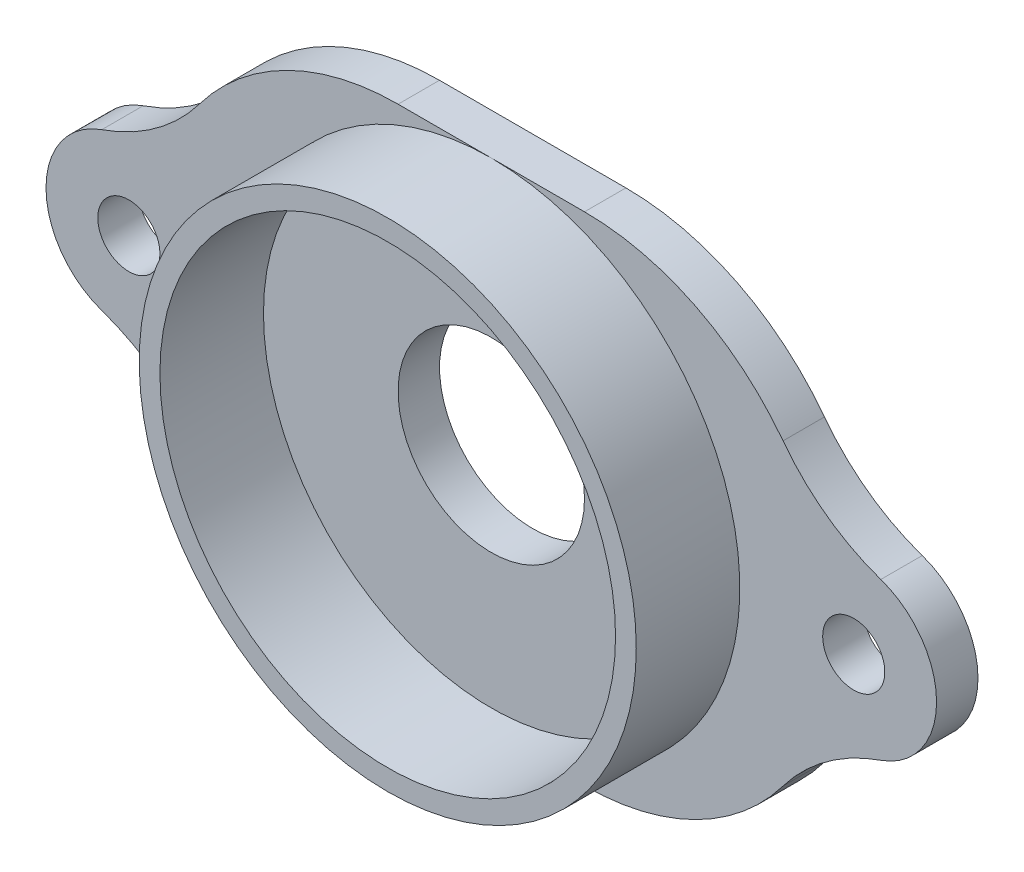
ISO-10303-21;
HEADER;
FILE_DESCRIPTION(('STEP AP214'),'2;1');
FILE_NAME('part.step','',(''),(''),'','','');
FILE_SCHEMA(('AUTOMOTIVE_DESIGN { 1 0 10303 214 1 1 1 1 }'));
ENDSEC;
DATA;
#1=APPLICATION_CONTEXT('core data for automotive mechanical design processes');
#2=APPLICATION_PROTOCOL_DEFINITION('international standard','automotive_design',2000,#1);
#3=PRODUCT_CONTEXT('',#1,'mechanical');
#4=PRODUCT('Part','Part','',(#3));
#5=PRODUCT_RELATED_PRODUCT_CATEGORY('part','',(#4));
#6=PRODUCT_DEFINITION_FORMATION('','',#4);
#7=PRODUCT_DEFINITION_CONTEXT('part definition',#1,'design');
#8=PRODUCT_DEFINITION('design','',#6,#7);
#9=PRODUCT_DEFINITION_SHAPE('','',#8);
#10=(LENGTH_UNIT() NAMED_UNIT(*) SI_UNIT(.MILLI.,.METRE.));
#11=(NAMED_UNIT(*) PLANE_ANGLE_UNIT() SI_UNIT($,.RADIAN.));
#12=(NAMED_UNIT(*) SI_UNIT($,.STERADIAN.) SOLID_ANGLE_UNIT());
#13=UNCERTAINTY_MEASURE_WITH_UNIT(LENGTH_MEASURE(1.E-05),#10,'distance_accuracy_value','');
#14=(GEOMETRIC_REPRESENTATION_CONTEXT(3) GLOBAL_UNCERTAINTY_ASSIGNED_CONTEXT((#13)) GLOBAL_UNIT_ASSIGNED_CONTEXT((#10,
#11,#12)) REPRESENTATION_CONTEXT('',''));
#15=CARTESIAN_POINT('',(0.,0.,0.));
#16=DIRECTION('',(0.,0.,1.));
#17=DIRECTION('',(1.,0.,0.));
#18=AXIS2_PLACEMENT_3D('',#15,#16,#17);
#19=CARTESIAN_POINT('',(4.5,0.,1.));
#20=DIRECTION('',(0.,0.,-1.));
#21=DIRECTION('',(-1.,0.,0.));
#22=AXIS2_PLACEMENT_3D('',#19,#20,#21);
#23=PLANE('',#22);
#24=CARTESIAN_POINT('',(-17.5,0.,1.));
#25=DIRECTION('',(0.,0.,-1.));
#26=DIRECTION('',(-1.,0.,0.));
#27=AXIS2_PLACEMENT_3D('',#24,#25,#26);
#28=CIRCLE('',#27,1.5);
#29=CARTESIAN_POINT('',(-19.,0.,1.));
#30=VERTEX_POINT('',#29);
#31=EDGE_CURVE('E351',#30,#30,#28,.T.);
#32=ORIENTED_EDGE('',*,*,#31,.T.);
#33=EDGE_LOOP('',(#32));
#34=FACE_BOUND('',#33,.T.);
#35=CARTESIAN_POINT('',(0.,0.,1.));
#36=DIRECTION('',(0.,0.,1.));
#37=DIRECTION('',(1.,0.,0.));
#38=AXIS2_PLACEMENT_3D('',#35,#36,#37);
#39=CIRCLE('',#38,12.);
#40=CARTESIAN_POINT('',(0.,12.,1.));
#41=VERTEX_POINT('',#40);
#42=CARTESIAN_POINT('',(0.,-12.,1.));
#43=VERTEX_POINT('',#42);
#44=EDGE_CURVE('E51',#41,#43,#39,.T.);
#45=ORIENTED_EDGE('',*,*,#44,.F.);
#46=DIRECTION('',(1.,0.,0.));
#47=VECTOR('',#46,1.);
#48=CARTESIAN_POINT('',(-4.5,12.,1.));
#49=LINE('',#48,#47);
#50=CARTESIAN_POINT('',(-4.5,12.,1.));
#51=VERTEX_POINT('',#50);
#52=EDGE_CURVE('E257',#51,#41,#49,.T.);
#53=ORIENTED_EDGE('',*,*,#52,.F.);
#54=CARTESIAN_POINT('',(-4.5,0.,1.));
#55=DIRECTION('',(0.,0.,1.));
#56=DIRECTION('',(1.,0.,0.));
#57=AXIS2_PLACEMENT_3D('',#54,#55,#56);
#58=CIRCLE('',#57,12.);
#59=CARTESIAN_POINT('',(-14.0874125874126,7.21675272395575,1.));
#60=VERTEX_POINT('',#59);
#61=EDGE_CURVE('E148',#51,#60,#58,.T.);
#62=ORIENTED_EDGE('',*,*,#61,.T.);
#63=CARTESIAN_POINT('',(-22.0769230769231,13.2307133272522,1.));
#64=DIRECTION('',(0.,0.,-1.));
#65=DIRECTION('',(-1.,0.,0.));
#66=AXIS2_PLACEMENT_3D('',#63,#64,#65);
#67=CIRCLE('',#66,10.);
#68=CARTESIAN_POINT('',(-18.8076923076923,3.78020380778634,1.));
#69=VERTEX_POINT('',#68);
#70=EDGE_CURVE('E140',#60,#69,#67,.T.);
#71=ORIENTED_EDGE('',*,*,#70,.T.);
#72=CARTESIAN_POINT('',(-17.5,0.,1.));
#73=DIRECTION('',(0.,0.,-1.));
#74=DIRECTION('',(-1.,0.,0.));
#75=AXIS2_PLACEMENT_3D('',#72,#73,#74);
#76=CIRCLE('',#75,4.);
#77=CARTESIAN_POINT('',(-18.8076923076923,-3.78020380778634,1.));
#78=VERTEX_POINT('',#77);
#79=EDGE_CURVE('E145',#78,#69,#76,.T.);
#80=ORIENTED_EDGE('',*,*,#79,.F.);
#81=CARTESIAN_POINT('',(-22.0769230769231,-13.2307133272522,1.));
#82=DIRECTION('',(0.,0.,1.));
#83=DIRECTION('',(1.,0.,0.));
#84=AXIS2_PLACEMENT_3D('',#81,#82,#83);
#85=CIRCLE('',#84,10.);
#86=CARTESIAN_POINT('',(-14.0874125874126,-7.21675272395575,1.));
#87=VERTEX_POINT('',#86);
#88=EDGE_CURVE('E168',#87,#78,#85,.T.);
#89=ORIENTED_EDGE('',*,*,#88,.F.);
#90=CARTESIAN_POINT('',(-4.5,0.,1.));
#91=DIRECTION('',(0.,0.,-1.));
#92=DIRECTION('',(-1.,0.,0.));
#93=AXIS2_PLACEMENT_3D('',#90,#91,#92);
#94=CIRCLE('',#93,12.);
#95=CARTESIAN_POINT('',(-4.5,-12.,1.));
#96=VERTEX_POINT('',#95);
#97=EDGE_CURVE('E171',#96,#87,#94,.T.);
#98=ORIENTED_EDGE('',*,*,#97,.F.);
#99=DIRECTION('',(1.,0.,0.));
#100=VECTOR('',#99,1.);
#101=CARTESIAN_POINT('',(-4.5,-12.,1.));
#102=LINE('',#101,#100);
#103=EDGE_CURVE('E282',#96,#43,#102,.T.);
#104=ORIENTED_EDGE('',*,*,#103,.T.);
#105=EDGE_LOOP('',(#45,#53,#62,#71,#80,#89,#98,#104));
#106=FACE_BOUND('',#105,.T.);
#107=ADVANCED_FACE('F39',(#34,#106),#23,.F.);
#108=CARTESIAN_POINT('',(-4.5,12.,1.));
#109=DIRECTION('',(0.,1.,0.));
#110=DIRECTION('',(0.,0.,1.));
#111=AXIS2_PLACEMENT_3D('',#108,#109,#110);
#112=PLANE('',#111);
#113=DIRECTION('',(1.,0.,0.));
#114=VECTOR('',#113,1.);
#115=CARTESIAN_POINT('',(-4.5,12.,-1.));
#116=LINE('',#115,#114);
#117=CARTESIAN_POINT('',(-4.5,12.,-1.));
#118=VERTEX_POINT('',#117);
#119=CARTESIAN_POINT('',(4.5,12.,-1.));
#120=VERTEX_POINT('',#119);
#121=EDGE_CURVE('E177',#118,#120,#116,.T.);
#122=ORIENTED_EDGE('',*,*,#121,.F.);
#123=DIRECTION('',(0.,0.,-1.));
#124=VECTOR('',#123,1.);
#125=CARTESIAN_POINT('',(-4.5,12.,1.));
#126=LINE('',#125,#124);
#127=EDGE_CURVE('E49',#51,#118,#126,.T.);
#128=ORIENTED_EDGE('',*,*,#127,.F.);
#129=ORIENTED_EDGE('',*,*,#52,.T.);
#130=CARTESIAN_POINT('',(4.5,12.,1.));
#131=VERTEX_POINT('',#130);
#132=EDGE_CURVE('E111',#41,#131,#49,.T.);
#133=ORIENTED_EDGE('',*,*,#132,.T.);
#134=DIRECTION('',(0.,0.,-1.));
#135=VECTOR('',#134,1.);
#136=CARTESIAN_POINT('',(4.5,12.,1.));
#137=LINE('',#136,#135);
#138=EDGE_CURVE('E43',#131,#120,#137,.T.);
#139=ORIENTED_EDGE('',*,*,#138,.T.);
#140=EDGE_LOOP('',(#122,#128,#129,#133,#139));
#141=FACE_BOUND('',#140,.T.);
#142=ADVANCED_FACE('F41',(#141),#112,.T.);
#143=CARTESIAN_POINT('',(-4.5,0.,1.));
#144=DIRECTION('',(0.,0.,-1.));
#145=DIRECTION('',(-1.,0.,0.));
#146=AXIS2_PLACEMENT_3D('',#143,#144,#145);
#147=CYLINDRICAL_SURFACE('',#146,12.);
#148=CARTESIAN_POINT('',(-4.5,0.,-1.));
#149=DIRECTION('',(0.,0.,1.));
#150=DIRECTION('',(1.,0.,0.));
#151=AXIS2_PLACEMENT_3D('',#148,#149,#150);
#152=CIRCLE('',#151,12.);
#153=CARTESIAN_POINT('',(-14.0874125874126,7.21675272395575,-1.));
#154=VERTEX_POINT('',#153);
#155=EDGE_CURVE('E216',#118,#154,#152,.T.);
#156=ORIENTED_EDGE('',*,*,#155,.T.);
#157=DIRECTION('',(0.,0.,-1.));
#158=VECTOR('',#157,1.);
#159=CARTESIAN_POINT('',(-14.0874125874126,7.21675272395575,1.));
#160=LINE('',#159,#158);
#161=EDGE_CURVE('E163',#60,#154,#160,.T.);
#162=ORIENTED_EDGE('',*,*,#161,.F.);
#163=ORIENTED_EDGE('',*,*,#61,.F.);
#164=ORIENTED_EDGE('',*,*,#127,.T.);
#165=EDGE_LOOP('',(#156,#162,#163,#164));
#166=FACE_BOUND('',#165,.T.);
#167=ADVANCED_FACE('F256',(#166),#147,.T.);
#168=CARTESIAN_POINT('',(-22.0769230769231,13.2307133272522,1.));
#169=DIRECTION('',(0.,0.,-1.));
#170=DIRECTION('',(-1.,0.,0.));
#171=AXIS2_PLACEMENT_3D('',#168,#169,#170);
#172=CYLINDRICAL_SURFACE('',#171,10.);
#173=CARTESIAN_POINT('',(-22.0769230769231,13.2307133272522,-1.));
#174=DIRECTION('',(0.,0.,-1.));
#175=DIRECTION('',(-1.,0.,0.));
#176=AXIS2_PLACEMENT_3D('',#173,#174,#175);
#177=CIRCLE('',#176,10.);
#178=CARTESIAN_POINT('',(-18.8076923076923,3.78020380778634,-1.));
#179=VERTEX_POINT('',#178);
#180=EDGE_CURVE('E158',#154,#179,#177,.T.);
#181=ORIENTED_EDGE('',*,*,#180,.T.);
#182=DIRECTION('',(0.,0.,-1.));
#183=VECTOR('',#182,1.);
#184=CARTESIAN_POINT('',(-18.8076923076923,3.78020380778634,1.));
#185=LINE('',#184,#183);
#186=EDGE_CURVE('E155',#69,#179,#185,.T.);
#187=ORIENTED_EDGE('',*,*,#186,.F.);
#188=ORIENTED_EDGE('',*,*,#70,.F.);
#189=ORIENTED_EDGE('',*,*,#161,.T.);
#190=EDGE_LOOP('',(#181,#187,#188,#189));
#191=FACE_BOUND('',#190,.T.);
#192=ADVANCED_FACE('F156',(#191),#172,.F.);
#193=CARTESIAN_POINT('',(-17.5,0.,1.));
#194=DIRECTION('',(0.,0.,-1.));
#195=DIRECTION('',(-1.,0.,0.));
#196=AXIS2_PLACEMENT_3D('',#193,#194,#195);
#197=CYLINDRICAL_SURFACE('',#196,4.);
#198=CARTESIAN_POINT('',(-17.5,0.,-1.));
#199=DIRECTION('',(0.,0.,-1.));
#200=DIRECTION('',(-1.,0.,0.));
#201=AXIS2_PLACEMENT_3D('',#198,#199,#200);
#202=CIRCLE('',#201,4.);
#203=CARTESIAN_POINT('',(-18.8076923076923,-3.78020380778634,-1.));
#204=VERTEX_POINT('',#203);
#205=EDGE_CURVE('E211',#204,#179,#202,.T.);
#206=ORIENTED_EDGE('',*,*,#205,.F.);
#207=DIRECTION('',(0.,0.,-1.));
#208=VECTOR('',#207,1.);
#209=CARTESIAN_POINT('',(-18.8076923076923,-3.78020380778634,1.));
#210=LINE('',#209,#208);
#211=EDGE_CURVE('E164',#78,#204,#210,.T.);
#212=ORIENTED_EDGE('',*,*,#211,.F.);
#213=ORIENTED_EDGE('',*,*,#79,.T.);
#214=ORIENTED_EDGE('',*,*,#186,.T.);
#215=EDGE_LOOP('',(#206,#212,#213,#214));
#216=FACE_BOUND('',#215,.T.);
#217=ADVANCED_FACE('F166',(#216),#197,.T.);
#218=CARTESIAN_POINT('',(-22.0769230769231,-13.2307133272522,1.));
#219=DIRECTION('',(0.,0.,-1.));
#220=DIRECTION('',(-1.,0.,0.));
#221=AXIS2_PLACEMENT_3D('',#218,#219,#220);
#222=CYLINDRICAL_SURFACE('',#221,10.);
#223=CARTESIAN_POINT('',(-22.0769230769231,-13.2307133272522,-1.));
#224=DIRECTION('',(0.,0.,1.));
#225=DIRECTION('',(1.,0.,0.));
#226=AXIS2_PLACEMENT_3D('',#223,#224,#225);
#227=CIRCLE('',#226,10.);
#228=CARTESIAN_POINT('',(-14.0874125874126,-7.21675272395575,-1.));
#229=VERTEX_POINT('',#228);
#230=EDGE_CURVE('E207',#229,#204,#227,.T.);
#231=ORIENTED_EDGE('',*,*,#230,.F.);
#232=DIRECTION('',(0.,0.,-1.));
#233=VECTOR('',#232,1.);
#234=CARTESIAN_POINT('',(-14.0874125874126,-7.21675272395575,1.));
#235=LINE('',#234,#233);
#236=EDGE_CURVE('E225',#87,#229,#235,.T.);
#237=ORIENTED_EDGE('',*,*,#236,.F.);
#238=ORIENTED_EDGE('',*,*,#88,.T.);
#239=ORIENTED_EDGE('',*,*,#211,.T.);
#240=EDGE_LOOP('',(#231,#237,#238,#239));
#241=FACE_BOUND('',#240,.T.);
#242=ADVANCED_FACE('F293',(#241),#222,.F.);
#243=CARTESIAN_POINT('',(-4.5,0.,1.));
#244=DIRECTION('',(0.,0.,-1.));
#245=DIRECTION('',(-1.,0.,0.));
#246=AXIS2_PLACEMENT_3D('',#243,#244,#245);
#247=CYLINDRICAL_SURFACE('',#246,12.);
#248=CARTESIAN_POINT('',(-4.5,0.,-1.));
#249=DIRECTION('',(0.,0.,-1.));
#250=DIRECTION('',(-1.,0.,0.));
#251=AXIS2_PLACEMENT_3D('',#248,#249,#250);
#252=CIRCLE('',#251,12.);
#253=CARTESIAN_POINT('',(-4.5,-12.,-1.));
#254=VERTEX_POINT('',#253);
#255=EDGE_CURVE('E203',#254,#229,#252,.T.);
#256=ORIENTED_EDGE('',*,*,#255,.F.);
#257=DIRECTION('',(0.,0.,-1.));
#258=VECTOR('',#257,1.);
#259=CARTESIAN_POINT('',(-4.5,-12.,1.));
#260=LINE('',#259,#258);
#261=EDGE_CURVE('E228',#96,#254,#260,.T.);
#262=ORIENTED_EDGE('',*,*,#261,.F.);
#263=ORIENTED_EDGE('',*,*,#97,.T.);
#264=ORIENTED_EDGE('',*,*,#236,.T.);
#265=EDGE_LOOP('',(#256,#262,#263,#264));
#266=FACE_BOUND('',#265,.T.);
#267=ADVANCED_FACE('F289',(#266),#247,.T.);
#268=CARTESIAN_POINT('',(-4.5,-12.,1.));
#269=DIRECTION('',(0.,1.,0.));
#270=DIRECTION('',(0.,0.,1.));
#271=AXIS2_PLACEMENT_3D('',#268,#269,#270);
#272=PLANE('',#271);
#273=DIRECTION('',(1.,0.,0.));
#274=VECTOR('',#273,1.);
#275=CARTESIAN_POINT('',(-4.5,-12.,-1.));
#276=LINE('',#275,#274);
#277=CARTESIAN_POINT('',(4.5,-12.,-1.));
#278=VERTEX_POINT('',#277);
#279=EDGE_CURVE('E200',#254,#278,#276,.T.);
#280=ORIENTED_EDGE('',*,*,#279,.T.);
#281=DIRECTION('',(0.,0.,-1.));
#282=VECTOR('',#281,1.);
#283=CARTESIAN_POINT('',(4.5,-12.,1.));
#284=LINE('',#283,#282);
#285=CARTESIAN_POINT('',(4.5,-12.,1.));
#286=VERTEX_POINT('',#285);
#287=EDGE_CURVE('E231',#286,#278,#284,.T.);
#288=ORIENTED_EDGE('',*,*,#287,.F.);
#289=EDGE_CURVE('E281',#43,#286,#102,.T.);
#290=ORIENTED_EDGE('',*,*,#289,.F.);
#291=ORIENTED_EDGE('',*,*,#103,.F.);
#292=ORIENTED_EDGE('',*,*,#261,.T.);
#293=EDGE_LOOP('',(#280,#288,#290,#291,#292));
#294=FACE_BOUND('',#293,.T.);
#295=ADVANCED_FACE('F299',(#294),#272,.F.);
#296=CARTESIAN_POINT('',(4.5,0.,1.));
#297=DIRECTION('',(0.,0.,-1.));
#298=DIRECTION('',(-1.,0.,0.));
#299=AXIS2_PLACEMENT_3D('',#296,#297,#298);
#300=CYLINDRICAL_SURFACE('',#299,12.);
#301=CARTESIAN_POINT('',(4.5,0.,-1.));
#302=DIRECTION('',(0.,0.,1.));
#303=DIRECTION('',(1.,0.,0.));
#304=AXIS2_PLACEMENT_3D('',#301,#302,#303);
#305=CIRCLE('',#304,12.);
#306=CARTESIAN_POINT('',(14.0874125874126,-7.21675272395575,-1.));
#307=VERTEX_POINT('',#306);
#308=EDGE_CURVE('E197',#278,#307,#305,.T.);
#309=ORIENTED_EDGE('',*,*,#308,.T.);
#310=DIRECTION('',(0.,0.,-1.));
#311=VECTOR('',#310,1.);
#312=CARTESIAN_POINT('',(14.0874125874126,-7.21675272395575,1.));
#313=LINE('',#312,#311);
#314=CARTESIAN_POINT('',(14.0874125874126,-7.21675272395575,1.));
#315=VERTEX_POINT('',#314);
#316=EDGE_CURVE('E235',#315,#307,#313,.T.);
#317=ORIENTED_EDGE('',*,*,#316,.F.);
#318=CARTESIAN_POINT('',(4.5,0.,1.));
#319=DIRECTION('',(0.,0.,1.));
#320=DIRECTION('',(1.,0.,0.));
#321=AXIS2_PLACEMENT_3D('',#318,#319,#320);
#322=CIRCLE('',#321,12.);
#323=EDGE_CURVE('E278',#286,#315,#322,.T.);
#324=ORIENTED_EDGE('',*,*,#323,.F.);
#325=ORIENTED_EDGE('',*,*,#287,.T.);
#326=EDGE_LOOP('',(#309,#317,#324,#325));
#327=FACE_BOUND('',#326,.T.);
#328=ADVANCED_FACE('F302',(#327),#300,.T.);
#329=CARTESIAN_POINT('',(22.0769230769231,-13.2307133272522,1.));
#330=DIRECTION('',(0.,0.,-1.));
#331=DIRECTION('',(-1.,0.,0.));
#332=AXIS2_PLACEMENT_3D('',#329,#330,#331);
#333=CYLINDRICAL_SURFACE('',#332,10.);
#334=CARTESIAN_POINT('',(22.0769230769231,-13.2307133272522,-1.));
#335=DIRECTION('',(0.,0.,-1.));
#336=DIRECTION('',(-1.,0.,0.));
#337=AXIS2_PLACEMENT_3D('',#334,#335,#336);
#338=CIRCLE('',#337,10.);
#339=CARTESIAN_POINT('',(18.8076923076923,-3.78020380778635,-1.));
#340=VERTEX_POINT('',#339);
#341=EDGE_CURVE('E194',#307,#340,#338,.T.);
#342=ORIENTED_EDGE('',*,*,#341,.T.);
#343=DIRECTION('',(0.,0.,-1.));
#344=VECTOR('',#343,1.);
#345=CARTESIAN_POINT('',(18.8076923076923,-3.78020380778635,1.));
#346=LINE('',#345,#344);
#347=CARTESIAN_POINT('',(18.8076923076923,-3.78020380778635,1.));
#348=VERTEX_POINT('',#347);
#349=EDGE_CURVE('E239',#348,#340,#346,.T.);
#350=ORIENTED_EDGE('',*,*,#349,.F.);
#351=CARTESIAN_POINT('',(22.0769230769231,-13.2307133272522,1.));
#352=DIRECTION('',(0.,0.,-1.));
#353=DIRECTION('',(-1.,0.,0.));
#354=AXIS2_PLACEMENT_3D('',#351,#352,#353);
#355=CIRCLE('',#354,10.);
#356=EDGE_CURVE('E275',#315,#348,#355,.T.);
#357=ORIENTED_EDGE('',*,*,#356,.F.);
#358=ORIENTED_EDGE('',*,*,#316,.T.);
#359=EDGE_LOOP('',(#342,#350,#357,#358));
#360=FACE_BOUND('',#359,.T.);
#361=ADVANCED_FACE('F312',(#360),#333,.F.);
#362=CARTESIAN_POINT('',(17.5,0.,1.));
#363=DIRECTION('',(0.,0.,-1.));
#364=DIRECTION('',(-1.,0.,0.));
#365=AXIS2_PLACEMENT_3D('',#362,#363,#364);
#366=CYLINDRICAL_SURFACE('',#365,4.);
#367=CARTESIAN_POINT('',(17.5,0.,-1.));
#368=DIRECTION('',(0.,0.,1.));
#369=DIRECTION('',(1.,0.,0.));
#370=AXIS2_PLACEMENT_3D('',#367,#368,#369);
#371=CIRCLE('',#370,4.);
#372=CARTESIAN_POINT('',(18.8076923076923,3.78020380778634,-1.));
#373=VERTEX_POINT('',#372);
#374=EDGE_CURVE('E190',#340,#373,#371,.T.);
#375=ORIENTED_EDGE('',*,*,#374,.T.);
#376=DIRECTION('',(0.,0.,-1.));
#377=VECTOR('',#376,1.);
#378=CARTESIAN_POINT('',(18.8076923076923,3.78020380778634,1.));
#379=LINE('',#378,#377);
#380=CARTESIAN_POINT('',(18.8076923076923,3.78020380778634,1.));
#381=VERTEX_POINT('',#380);
#382=EDGE_CURVE('E243',#381,#373,#379,.T.);
#383=ORIENTED_EDGE('',*,*,#382,.F.);
#384=CARTESIAN_POINT('',(17.5,0.,1.));
#385=DIRECTION('',(0.,0.,1.));
#386=DIRECTION('',(1.,0.,0.));
#387=AXIS2_PLACEMENT_3D('',#384,#385,#386);
#388=CIRCLE('',#387,4.);
#389=EDGE_CURVE('E272',#348,#381,#388,.T.);
#390=ORIENTED_EDGE('',*,*,#389,.F.);
#391=ORIENTED_EDGE('',*,*,#349,.T.);
#392=EDGE_LOOP('',(#375,#383,#390,#391));
#393=FACE_BOUND('',#392,.T.);
#394=ADVANCED_FACE('F315',(#393),#366,.T.);
#395=CARTESIAN_POINT('',(22.0769230769231,13.2307133272522,1.));
#396=DIRECTION('',(0.,0.,-1.));
#397=DIRECTION('',(-1.,0.,0.));
#398=AXIS2_PLACEMENT_3D('',#395,#396,#397);
#399=CYLINDRICAL_SURFACE('',#398,10.);
#400=CARTESIAN_POINT('',(22.0769230769231,13.2307133272522,-1.));
#401=DIRECTION('',(0.,0.,1.));
#402=DIRECTION('',(1.,0.,0.));
#403=AXIS2_PLACEMENT_3D('',#400,#401,#402);
#404=CIRCLE('',#403,10.);
#405=CARTESIAN_POINT('',(14.0874125874126,7.21675272395575,-1.));
#406=VERTEX_POINT('',#405);
#407=EDGE_CURVE('E186',#406,#373,#404,.T.);
#408=ORIENTED_EDGE('',*,*,#407,.F.);
#409=DIRECTION('',(0.,0.,-1.));
#410=VECTOR('',#409,1.);
#411=CARTESIAN_POINT('',(14.0874125874126,7.21675272395575,1.));
#412=LINE('',#411,#410);
#413=CARTESIAN_POINT('',(14.0874125874126,7.21675272395575,1.));
#414=VERTEX_POINT('',#413);
#415=EDGE_CURVE('E245',#414,#406,#412,.T.);
#416=ORIENTED_EDGE('',*,*,#415,.F.);
#417=CARTESIAN_POINT('',(22.0769230769231,13.2307133272522,1.));
#418=DIRECTION('',(0.,0.,1.));
#419=DIRECTION('',(1.,0.,0.));
#420=AXIS2_PLACEMENT_3D('',#417,#418,#419);
#421=CIRCLE('',#420,10.);
#422=EDGE_CURVE('E265',#414,#381,#421,.T.);
#423=ORIENTED_EDGE('',*,*,#422,.T.);
#424=ORIENTED_EDGE('',*,*,#382,.T.);
#425=EDGE_LOOP('',(#408,#416,#423,#424));
#426=FACE_BOUND('',#425,.T.);
#427=ADVANCED_FACE('F317',(#426),#399,.F.);
#428=CARTESIAN_POINT('',(4.5,0.,1.));
#429=DIRECTION('',(0.,0.,-1.));
#430=DIRECTION('',(-1.,0.,0.));
#431=AXIS2_PLACEMENT_3D('',#428,#429,#430);
#432=CYLINDRICAL_SURFACE('',#431,12.);
#433=CARTESIAN_POINT('',(4.5,0.,-1.));
#434=DIRECTION('',(0.,0.,-1.));
#435=DIRECTION('',(-1.,0.,0.));
#436=AXIS2_PLACEMENT_3D('',#433,#434,#435);
#437=CIRCLE('',#436,12.);
#438=EDGE_CURVE('E181',#120,#406,#437,.T.);
#439=ORIENTED_EDGE('',*,*,#438,.F.);
#440=ORIENTED_EDGE('',*,*,#138,.F.);
#441=CARTESIAN_POINT('',(4.5,0.,1.));
#442=DIRECTION('',(0.,0.,-1.));
#443=DIRECTION('',(-1.,0.,0.));
#444=AXIS2_PLACEMENT_3D('',#441,#442,#443);
#445=CIRCLE('',#444,12.);
#446=EDGE_CURVE('E261',#131,#414,#445,.T.);
#447=ORIENTED_EDGE('',*,*,#446,.T.);
#448=ORIENTED_EDGE('',*,*,#415,.T.);
#449=EDGE_LOOP('',(#439,#440,#447,#448));
#450=FACE_BOUND('',#449,.T.);
#451=ADVANCED_FACE('F253',(#450),#432,.T.);
#452=CARTESIAN_POINT('',(17.5,0.,1.));
#453=DIRECTION('',(0.,0.,-1.));
#454=DIRECTION('',(-1.,0.,0.));
#455=AXIS2_PLACEMENT_3D('',#452,#453,#454);
#456=CIRCLE('',#455,1.5);
#457=CARTESIAN_POINT('',(16.,0.,1.));
#458=VERTEX_POINT('',#457);
#459=EDGE_CURVE('E348',#458,#458,#456,.T.);
#460=ORIENTED_EDGE('',*,*,#459,.T.);
#461=EDGE_LOOP('',(#460));
#462=FACE_BOUND('',#461,.T.);
#463=EDGE_CURVE('E11',#43,#41,#39,.T.);
#464=ORIENTED_EDGE('',*,*,#463,.F.);
#465=ORIENTED_EDGE('',*,*,#289,.T.);
#466=ORIENTED_EDGE('',*,*,#323,.T.);
#467=ORIENTED_EDGE('',*,*,#356,.T.);
#468=ORIENTED_EDGE('',*,*,#389,.T.);
#469=ORIENTED_EDGE('',*,*,#422,.F.);
#470=ORIENTED_EDGE('',*,*,#446,.F.);
#471=ORIENTED_EDGE('',*,*,#132,.F.);
#472=EDGE_LOOP('',(#464,#465,#466,#467,#468,#469,#470,#471));
#473=FACE_BOUND('',#472,.T.);
#474=ADVANCED_FACE('F305',(#462,#473),#23,.F.);
#475=CARTESIAN_POINT('',(4.5,0.,-1.));
#476=DIRECTION('',(0.,0.,-1.));
#477=DIRECTION('',(-1.,0.,0.));
#478=AXIS2_PLACEMENT_3D('',#475,#476,#477);
#479=PLANE('',#478);
#480=CARTESIAN_POINT('',(-17.5,0.,-1.));
#481=DIRECTION('',(0.,0.,-1.));
#482=DIRECTION('',(-1.,0.,0.));
#483=AXIS2_PLACEMENT_3D('',#480,#481,#482);
#484=CIRCLE('',#483,1.5);
#485=CARTESIAN_POINT('',(-19.,0.,-1.));
#486=VERTEX_POINT('',#485);
#487=EDGE_CURVE('E352',#486,#486,#484,.T.);
#488=ORIENTED_EDGE('',*,*,#487,.F.);
#489=EDGE_LOOP('',(#488));
#490=FACE_BOUND('',#489,.T.);
#491=CARTESIAN_POINT('',(17.5,0.,-1.));
#492=DIRECTION('',(0.,0.,-1.));
#493=DIRECTION('',(-1.,0.,0.));
#494=AXIS2_PLACEMENT_3D('',#491,#492,#493);
#495=CIRCLE('',#494,1.5);
#496=CARTESIAN_POINT('',(16.,0.,-1.));
#497=VERTEX_POINT('',#496);
#498=EDGE_CURVE('E359',#497,#497,#495,.T.);
#499=ORIENTED_EDGE('',*,*,#498,.F.);
#500=EDGE_LOOP('',(#499));
#501=FACE_BOUND('',#500,.T.);
#502=CARTESIAN_POINT('',(0.,0.,-1.));
#503=DIRECTION('',(0.,0.,1.));
#504=DIRECTION('',(1.,0.,0.));
#505=AXIS2_PLACEMENT_3D('',#502,#503,#504);
#506=CIRCLE('',#505,4.5);
#507=CARTESIAN_POINT('',(4.5,0.,-1.));
#508=VERTEX_POINT('',#507);
#509=EDGE_CURVE('E363',#508,#508,#506,.T.);
#510=ORIENTED_EDGE('',*,*,#509,.T.);
#511=EDGE_LOOP('',(#510));
#512=FACE_BOUND('',#511,.T.);
#513=ORIENTED_EDGE('',*,*,#121,.T.);
#514=ORIENTED_EDGE('',*,*,#438,.T.);
#515=ORIENTED_EDGE('',*,*,#407,.T.);
#516=ORIENTED_EDGE('',*,*,#374,.F.);
#517=ORIENTED_EDGE('',*,*,#341,.F.);
#518=ORIENTED_EDGE('',*,*,#308,.F.);
#519=ORIENTED_EDGE('',*,*,#279,.F.);
#520=ORIENTED_EDGE('',*,*,#255,.T.);
#521=ORIENTED_EDGE('',*,*,#230,.T.);
#522=ORIENTED_EDGE('',*,*,#205,.T.);
#523=ORIENTED_EDGE('',*,*,#180,.F.);
#524=ORIENTED_EDGE('',*,*,#155,.F.);
#525=EDGE_LOOP('',(#513,#514,#515,#516,#517,#518,#519,#520,#521,#522,#523,#524));
#526=FACE_BOUND('',#525,.T.);
#527=ADVANCED_FACE('F255',(#490,#501,#512,#526),#479,.T.);
#528=CARTESIAN_POINT('',(0.,0.,6.));
#529=DIRECTION('',(0.,0.,1.));
#530=DIRECTION('',(1.,0.,0.));
#531=AXIS2_PLACEMENT_3D('',#528,#529,#530);
#532=PLANE('',#531);
#533=CARTESIAN_POINT('',(0.,0.,6.));
#534=DIRECTION('',(0.,0.,1.));
#535=DIRECTION('',(1.,0.,0.));
#536=AXIS2_PLACEMENT_3D('',#533,#534,#535);
#537=CIRCLE('',#536,12.);
#538=CARTESIAN_POINT('',(12.,0.,6.));
#539=VERTEX_POINT('',#538);
#540=EDGE_CURVE('E182',#539,#539,#537,.T.);
#541=ORIENTED_EDGE('',*,*,#540,.T.);
#542=EDGE_LOOP('',(#541));
#543=FACE_BOUND('',#542,.T.);
#544=CARTESIAN_POINT('',(0.,0.,6.));
#545=DIRECTION('',(0.,0.,1.));
#546=DIRECTION('',(1.,0.,0.));
#547=AXIS2_PLACEMENT_3D('',#544,#545,#546);
#548=CIRCLE('',#547,11.);
#549=CARTESIAN_POINT('',(11.,0.,6.));
#550=VERTEX_POINT('',#549);
#551=EDGE_CURVE('E371',#550,#550,#548,.T.);
#552=ORIENTED_EDGE('',*,*,#551,.F.);
#553=EDGE_LOOP('',(#552));
#554=FACE_BOUND('',#553,.T.);
#555=ADVANCED_FACE('F344',(#543,#554),#532,.T.);
#556=CARTESIAN_POINT('',(0.,0.,6.));
#557=DIRECTION('',(0.,0.,-1.));
#558=DIRECTION('',(-1.,0.,0.));
#559=AXIS2_PLACEMENT_3D('',#556,#557,#558);
#560=CYLINDRICAL_SURFACE('',#559,12.);
#561=ORIENTED_EDGE('',*,*,#540,.F.);
#562=EDGE_LOOP('',(#561));
#563=FACE_BOUND('',#562,.T.);
#564=ORIENTED_EDGE('',*,*,#44,.T.);
#565=ORIENTED_EDGE('',*,*,#463,.T.);
#566=EDGE_LOOP('',(#564,#565));
#567=FACE_BOUND('',#566,.T.);
#568=ADVANCED_FACE('F383',(#563,#567),#560,.T.);
#569=CARTESIAN_POINT('',(0.,0.,6.));
#570=DIRECTION('',(0.,0.,-1.));
#571=DIRECTION('',(-1.,0.,0.));
#572=AXIS2_PLACEMENT_3D('',#569,#570,#571);
#573=CYLINDRICAL_SURFACE('',#572,11.);
#574=ORIENTED_EDGE('',*,*,#551,.T.);
#575=EDGE_LOOP('',(#574));
#576=FACE_BOUND('',#575,.T.);
#577=CARTESIAN_POINT('',(0.,0.,1.));
#578=DIRECTION('',(0.,0.,1.));
#579=DIRECTION('',(1.,0.,0.));
#580=AXIS2_PLACEMENT_3D('',#577,#578,#579);
#581=CIRCLE('',#580,11.);
#582=CARTESIAN_POINT('',(11.,0.,1.));
#583=VERTEX_POINT('',#582);
#584=EDGE_CURVE('E367',#583,#583,#581,.T.);
#585=ORIENTED_EDGE('',*,*,#584,.F.);
#586=EDGE_LOOP('',(#585));
#587=FACE_BOUND('',#586,.T.);
#588=ADVANCED_FACE('F337',(#576,#587),#573,.F.);
#589=CARTESIAN_POINT('',(0.,0.,1.));
#590=DIRECTION('',(0.,0.,1.));
#591=DIRECTION('',(1.,0.,0.));
#592=AXIS2_PLACEMENT_3D('',#589,#590,#591);
#593=CIRCLE('',#592,4.5);
#594=CARTESIAN_POINT('',(4.5,0.,1.));
#595=VERTEX_POINT('',#594);
#596=EDGE_CURVE('E356',#595,#595,#593,.T.);
#597=ORIENTED_EDGE('',*,*,#596,.F.);
#598=EDGE_LOOP('',(#597));
#599=FACE_BOUND('',#598,.T.);
#600=ORIENTED_EDGE('',*,*,#584,.T.);
#601=EDGE_LOOP('',(#600));
#602=FACE_BOUND('',#601,.T.);
#603=ADVANCED_FACE('F328',(#599,#602),#23,.F.);
#604=CARTESIAN_POINT('',(0.,0.,-1.));
#605=DIRECTION('',(0.,0.,1.));
#606=DIRECTION('',(1.,0.,0.));
#607=AXIS2_PLACEMENT_3D('',#604,#605,#606);
#608=CYLINDRICAL_SURFACE('',#607,4.5);
#609=ORIENTED_EDGE('',*,*,#509,.F.);
#610=EDGE_LOOP('',(#609));
#611=FACE_BOUND('',#610,.T.);
#612=ORIENTED_EDGE('',*,*,#596,.T.);
#613=EDGE_LOOP('',(#612));
#614=FACE_BOUND('',#613,.T.);
#615=ADVANCED_FACE('F336',(#611,#614),#608,.F.);
#616=CARTESIAN_POINT('',(17.5,0.,6.));
#617=DIRECTION('',(0.,0.,-1.));
#618=DIRECTION('',(-1.,0.,0.));
#619=AXIS2_PLACEMENT_3D('',#616,#617,#618);
#620=CYLINDRICAL_SURFACE('',#619,1.5);
#621=ORIENTED_EDGE('',*,*,#498,.T.);
#622=EDGE_LOOP('',(#621));
#623=FACE_BOUND('',#622,.T.);
#624=ORIENTED_EDGE('',*,*,#459,.F.);
#625=EDGE_LOOP('',(#624));
#626=FACE_BOUND('',#625,.T.);
#627=ADVANCED_FACE('F396',(#623,#626),#620,.F.);
#628=CARTESIAN_POINT('',(-17.5,0.,6.));
#629=DIRECTION('',(0.,0.,-1.));
#630=DIRECTION('',(-1.,0.,0.));
#631=AXIS2_PLACEMENT_3D('',#628,#629,#630);
#632=CYLINDRICAL_SURFACE('',#631,1.5);
#633=ORIENTED_EDGE('',*,*,#487,.T.);
#634=EDGE_LOOP('',(#633));
#635=FACE_BOUND('',#634,.T.);
#636=ORIENTED_EDGE('',*,*,#31,.F.);
#637=EDGE_LOOP('',(#636));
#638=FACE_BOUND('',#637,.T.);
#639=ADVANCED_FACE('F400',(#635,#638),#632,.F.);
#640=CLOSED_SHELL('',(#107,#142,#167,#192,#217,#242,#267,#295,#328,#361,#394,#427,#451,#474,
#527,#555,#568,#588,#603,#615,#627,#639));
#641=MANIFOLD_SOLID_BREP('B2',#640);
#642=ADVANCED_BREP_SHAPE_REPRESENTATION('',(#18,#641),#14);
#643=SHAPE_DEFINITION_REPRESENTATION(#9,#642);
ENDSEC;
END-ISO-10303-21;
